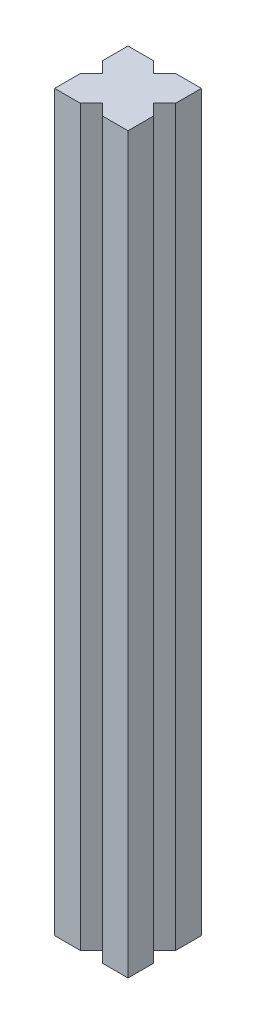
ISO-10303-21;
HEADER;
FILE_DESCRIPTION(('STEP AP214'),'2;1');
FILE_NAME('part.step','',(''),(''),'','','');
FILE_SCHEMA(('AUTOMOTIVE_DESIGN { 1 0 10303 214 1 1 1 1 }'));
ENDSEC;
DATA;
#1=APPLICATION_CONTEXT('core data for automotive mechanical design processes');
#2=APPLICATION_PROTOCOL_DEFINITION('international standard','automotive_design',2000,#1);
#3=PRODUCT_CONTEXT('',#1,'mechanical');
#4=PRODUCT('Part','Part','',(#3));
#5=PRODUCT_RELATED_PRODUCT_CATEGORY('part','',(#4));
#6=PRODUCT_DEFINITION_FORMATION('','',#4);
#7=PRODUCT_DEFINITION_CONTEXT('part definition',#1,'design');
#8=PRODUCT_DEFINITION('design','',#6,#7);
#9=PRODUCT_DEFINITION_SHAPE('','',#8);
#10=(LENGTH_UNIT() NAMED_UNIT(*) SI_UNIT(.MILLI.,.METRE.));
#11=(NAMED_UNIT(*) PLANE_ANGLE_UNIT() SI_UNIT($,.RADIAN.));
#12=(NAMED_UNIT(*) SI_UNIT($,.STERADIAN.) SOLID_ANGLE_UNIT());
#13=UNCERTAINTY_MEASURE_WITH_UNIT(LENGTH_MEASURE(1.E-05),#10,'distance_accuracy_value','');
#14=(GEOMETRIC_REPRESENTATION_CONTEXT(3) GLOBAL_UNCERTAINTY_ASSIGNED_CONTEXT((#13)) GLOBAL_UNIT_ASSIGNED_CONTEXT((#10,
#11,#12)) REPRESENTATION_CONTEXT('',''));
#15=CARTESIAN_POINT('',(0.,0.,0.));
#16=DIRECTION('',(0.,0.,1.));
#17=DIRECTION('',(1.,0.,0.));
#18=AXIS2_PLACEMENT_3D('',#15,#16,#17);
#19=CARTESIAN_POINT('',(0.,200.,0.));
#20=DIRECTION('',(1.,0.,0.));
#21=DIRECTION('',(0.,0.,-1.));
#22=AXIS2_PLACEMENT_3D('',#19,#20,#21);
#23=PLANE('',#22);
#24=DIRECTION('',(0.,0.,1.));
#25=VECTOR('',#24,1.);
#26=CARTESIAN_POINT('',(0.,200.,0.));
#27=LINE('',#26,#25);
#28=CARTESIAN_POINT('',(0.,200.,-7.));
#29=VERTEX_POINT('',#28);
#30=CARTESIAN_POINT('',(0.,200.,0.));
#31=VERTEX_POINT('',#30);
#32=EDGE_CURVE('E181',#29,#31,#27,.T.);
#33=ORIENTED_EDGE('',*,*,#32,.F.);
#34=DIRECTION('',(0.,1.,0.));
#35=VECTOR('',#34,1.);
#36=CARTESIAN_POINT('',(0.,0.,-7.));
#37=LINE('',#36,#35);
#38=CARTESIAN_POINT('',(0.,0.,-7.));
#39=VERTEX_POINT('',#38);
#40=EDGE_CURVE('E231',#39,#29,#37,.T.);
#41=ORIENTED_EDGE('',*,*,#40,.F.);
#42=DIRECTION('',(0.,0.,1.));
#43=VECTOR('',#42,1.);
#44=CARTESIAN_POINT('',(0.,0.,0.));
#45=LINE('',#44,#43);
#46=CARTESIAN_POINT('',(0.,0.,0.));
#47=VERTEX_POINT('',#46);
#48=EDGE_CURVE('E293',#39,#47,#45,.T.);
#49=ORIENTED_EDGE('',*,*,#48,.T.);
#50=DIRECTION('',(0.,-1.,0.));
#51=VECTOR('',#50,1.);
#52=CARTESIAN_POINT('',(0.,200.,0.));
#53=LINE('',#52,#51);
#54=EDGE_CURVE('E11',#31,#47,#53,.T.);
#55=ORIENTED_EDGE('',*,*,#54,.F.);
#56=EDGE_LOOP('',(#33,#41,#49,#55));
#57=FACE_BOUND('',#56,.T.);
#58=ADVANCED_FACE('F34',(#57),#23,.F.);
#59=CARTESIAN_POINT('',(0.,200.,0.));
#60=DIRECTION('',(0.,0.,-1.));
#61=DIRECTION('',(-1.,0.,0.));
#62=AXIS2_PLACEMENT_3D('',#59,#60,#61);
#63=PLANE('',#62);
#64=DIRECTION('',(1.,0.,0.));
#65=VECTOR('',#64,1.);
#66=CARTESIAN_POINT('',(0.,0.,0.));
#67=LINE('',#66,#65);
#68=CARTESIAN_POINT('',(7.,0.,0.));
#69=VERTEX_POINT('',#68);
#70=EDGE_CURVE('E294',#47,#69,#67,.T.);
#71=ORIENTED_EDGE('',*,*,#70,.T.);
#72=DIRECTION('',(0.,1.,0.));
#73=VECTOR('',#72,1.);
#74=CARTESIAN_POINT('',(7.,0.,0.));
#75=LINE('',#74,#73);
#76=CARTESIAN_POINT('',(7.,200.,0.));
#77=VERTEX_POINT('',#76);
#78=EDGE_CURVE('E265',#69,#77,#75,.T.);
#79=ORIENTED_EDGE('',*,*,#78,.T.);
#80=DIRECTION('',(1.,0.,0.));
#81=VECTOR('',#80,1.);
#82=CARTESIAN_POINT('',(0.,200.,0.));
#83=LINE('',#82,#81);
#84=EDGE_CURVE('E284',#31,#77,#83,.T.);
#85=ORIENTED_EDGE('',*,*,#84,.F.);
#86=ORIENTED_EDGE('',*,*,#54,.T.);
#87=EDGE_LOOP('',(#71,#79,#85,#86));
#88=FACE_BOUND('',#87,.T.);
#89=ADVANCED_FACE('F311',(#88),#63,.F.);
#90=CARTESIAN_POINT('',(20.,200.,0.));
#91=DIRECTION('',(-1.,0.,0.));
#92=DIRECTION('',(0.,0.,1.));
#93=AXIS2_PLACEMENT_3D('',#90,#91,#92);
#94=PLANE('',#93);
#95=DIRECTION('',(0.,0.,-1.));
#96=VECTOR('',#95,1.);
#97=CARTESIAN_POINT('',(20.,0.,0.));
#98=LINE('',#97,#96);
#99=CARTESIAN_POINT('',(20.,0.,0.));
#100=VERTEX_POINT('',#99);
#101=CARTESIAN_POINT('',(20.,0.,-7.));
#102=VERTEX_POINT('',#101);
#103=EDGE_CURVE('E174',#100,#102,#98,.T.);
#104=ORIENTED_EDGE('',*,*,#103,.T.);
#105=DIRECTION('',(0.,1.,0.));
#106=VECTOR('',#105,1.);
#107=CARTESIAN_POINT('',(20.,0.,-7.));
#108=LINE('',#107,#106);
#109=CARTESIAN_POINT('',(20.,200.,-7.));
#110=VERTEX_POINT('',#109);
#111=EDGE_CURVE('E233',#102,#110,#108,.T.);
#112=ORIENTED_EDGE('',*,*,#111,.T.);
#113=DIRECTION('',(0.,0.,-1.));
#114=VECTOR('',#113,1.);
#115=CARTESIAN_POINT('',(20.,200.,0.));
#116=LINE('',#115,#114);
#117=CARTESIAN_POINT('',(20.,200.,0.));
#118=VERTEX_POINT('',#117);
#119=EDGE_CURVE('E207',#118,#110,#116,.T.);
#120=ORIENTED_EDGE('',*,*,#119,.F.);
#121=DIRECTION('',(0.,-1.,0.));
#122=VECTOR('',#121,1.);
#123=CARTESIAN_POINT('',(20.,200.,0.));
#124=LINE('',#123,#122);
#125=EDGE_CURVE('E43',#118,#100,#124,.T.);
#126=ORIENTED_EDGE('',*,*,#125,.T.);
#127=EDGE_LOOP('',(#104,#112,#120,#126));
#128=FACE_BOUND('',#127,.T.);
#129=ADVANCED_FACE('F204',(#128),#94,.F.);
#130=CARTESIAN_POINT('',(0.,200.,-20.));
#131=DIRECTION('',(0.,0.,1.));
#132=DIRECTION('',(1.,0.,0.));
#133=AXIS2_PLACEMENT_3D('',#130,#131,#132);
#134=PLANE('',#133);
#135=DIRECTION('',(-1.,0.,0.));
#136=VECTOR('',#135,1.);
#137=CARTESIAN_POINT('',(0.,0.,-20.));
#138=LINE('',#137,#136);
#139=CARTESIAN_POINT('',(20.,0.,-20.));
#140=VERTEX_POINT('',#139);
#141=CARTESIAN_POINT('',(13.,0.,-20.));
#142=VERTEX_POINT('',#141);
#143=EDGE_CURVE('E173',#140,#142,#138,.T.);
#144=ORIENTED_EDGE('',*,*,#143,.T.);
#145=DIRECTION('',(0.,1.,0.));
#146=VECTOR('',#145,1.);
#147=CARTESIAN_POINT('',(13.,0.,-20.));
#148=LINE('',#147,#146);
#149=CARTESIAN_POINT('',(13.,200.,-20.));
#150=VERTEX_POINT('',#149);
#151=EDGE_CURVE('E317',#142,#150,#148,.T.);
#152=ORIENTED_EDGE('',*,*,#151,.T.);
#153=DIRECTION('',(-1.,0.,0.));
#154=VECTOR('',#153,1.);
#155=CARTESIAN_POINT('',(0.,200.,-20.));
#156=LINE('',#155,#154);
#157=CARTESIAN_POINT('',(20.,200.,-20.));
#158=VERTEX_POINT('',#157);
#159=EDGE_CURVE('E192',#158,#150,#156,.T.);
#160=ORIENTED_EDGE('',*,*,#159,.F.);
#161=DIRECTION('',(0.,-1.,0.));
#162=VECTOR('',#161,1.);
#163=CARTESIAN_POINT('',(20.,200.,-20.));
#164=LINE('',#163,#162);
#165=EDGE_CURVE('E191',#158,#140,#164,.T.);
#166=ORIENTED_EDGE('',*,*,#165,.T.);
#167=EDGE_LOOP('',(#144,#152,#160,#166));
#168=FACE_BOUND('',#167,.T.);
#169=ADVANCED_FACE('F333',(#168),#134,.F.);
#170=CARTESIAN_POINT('',(0.,0.,-20.));
#171=VERTEX_POINT('',#170);
#172=CARTESIAN_POINT('',(0.,0.,-13.));
#173=VERTEX_POINT('',#172);
#174=EDGE_CURVE('E171',#171,#173,#45,.T.);
#175=ORIENTED_EDGE('',*,*,#174,.T.);
#176=DIRECTION('',(0.,1.,0.));
#177=VECTOR('',#176,1.);
#178=CARTESIAN_POINT('',(0.,0.,-13.));
#179=LINE('',#178,#177);
#180=CARTESIAN_POINT('',(0.,200.,-13.));
#181=VERTEX_POINT('',#180);
#182=EDGE_CURVE('E254',#173,#181,#179,.T.);
#183=ORIENTED_EDGE('',*,*,#182,.T.);
#184=CARTESIAN_POINT('',(0.,200.,-20.));
#185=VERTEX_POINT('',#184);
#186=EDGE_CURVE('E279',#185,#181,#27,.T.);
#187=ORIENTED_EDGE('',*,*,#186,.F.);
#188=DIRECTION('',(0.,-1.,0.));
#189=VECTOR('',#188,1.);
#190=CARTESIAN_POINT('',(0.,200.,-20.));
#191=LINE('',#190,#189);
#192=EDGE_CURVE('E188',#185,#171,#191,.T.);
#193=ORIENTED_EDGE('',*,*,#192,.T.);
#194=EDGE_LOOP('',(#175,#183,#187,#193));
#195=FACE_BOUND('',#194,.T.);
#196=ADVANCED_FACE('F36',(#195),#23,.F.);
#197=CARTESIAN_POINT('',(13.,200.,0.));
#198=VERTEX_POINT('',#197);
#199=EDGE_CURVE('E283',#198,#118,#83,.T.);
#200=ORIENTED_EDGE('',*,*,#199,.F.);
#201=DIRECTION('',(0.,1.,0.));
#202=VECTOR('',#201,1.);
#203=CARTESIAN_POINT('',(13.,0.,0.));
#204=LINE('',#203,#202);
#205=CARTESIAN_POINT('',(13.,0.,0.));
#206=VERTEX_POINT('',#205);
#207=EDGE_CURVE('E274',#206,#198,#204,.T.);
#208=ORIENTED_EDGE('',*,*,#207,.F.);
#209=EDGE_CURVE('E212',#206,#100,#67,.T.);
#210=ORIENTED_EDGE('',*,*,#209,.T.);
#211=ORIENTED_EDGE('',*,*,#125,.F.);
#212=EDGE_LOOP('',(#200,#208,#210,#211));
#213=FACE_BOUND('',#212,.T.);
#214=ADVANCED_FACE('F300',(#213),#63,.F.);
#215=CARTESIAN_POINT('',(20.,200.,-13.));
#216=VERTEX_POINT('',#215);
#217=EDGE_CURVE('E287',#216,#158,#116,.T.);
#218=ORIENTED_EDGE('',*,*,#217,.F.);
#219=DIRECTION('',(0.,1.,0.));
#220=VECTOR('',#219,1.);
#221=CARTESIAN_POINT('',(20.,0.,-13.));
#222=LINE('',#221,#220);
#223=CARTESIAN_POINT('',(20.,0.,-13.));
#224=VERTEX_POINT('',#223);
#225=EDGE_CURVE('E216',#224,#216,#222,.T.);
#226=ORIENTED_EDGE('',*,*,#225,.F.);
#227=EDGE_CURVE('E184',#224,#140,#98,.T.);
#228=ORIENTED_EDGE('',*,*,#227,.T.);
#229=ORIENTED_EDGE('',*,*,#165,.F.);
#230=EDGE_LOOP('',(#218,#226,#228,#229));
#231=FACE_BOUND('',#230,.T.);
#232=ADVANCED_FACE('F337',(#231),#94,.F.);
#233=CARTESIAN_POINT('',(7.,200.,-20.));
#234=VERTEX_POINT('',#233);
#235=EDGE_CURVE('E164',#234,#185,#156,.T.);
#236=ORIENTED_EDGE('',*,*,#235,.F.);
#237=DIRECTION('',(0.,1.,0.));
#238=VECTOR('',#237,1.);
#239=CARTESIAN_POINT('',(7.,0.,-20.));
#240=LINE('',#239,#238);
#241=CARTESIAN_POINT('',(7.,0.,-20.));
#242=VERTEX_POINT('',#241);
#243=EDGE_CURVE('E151',#242,#234,#240,.T.);
#244=ORIENTED_EDGE('',*,*,#243,.F.);
#245=EDGE_CURVE('E162',#242,#171,#138,.T.);
#246=ORIENTED_EDGE('',*,*,#245,.T.);
#247=ORIENTED_EDGE('',*,*,#192,.F.);
#248=EDGE_LOOP('',(#236,#244,#246,#247));
#249=FACE_BOUND('',#248,.T.);
#250=ADVANCED_FACE('F160',(#249),#134,.F.);
#251=CARTESIAN_POINT('',(0.,200.,0.));
#252=DIRECTION('',(0.,-1.,0.));
#253=DIRECTION('',(0.,0.,-1.));
#254=AXIS2_PLACEMENT_3D('',#251,#252,#253);
#255=PLANE('',#254);
#256=ORIENTED_EDGE('',*,*,#159,.T.);
#257=DIRECTION('',(0.707106781186548,0.,-0.707106781186547));
#258=VECTOR('',#257,1.);
#259=CARTESIAN_POINT('',(13.,200.,-20.));
#260=LINE('',#259,#258);
#261=CARTESIAN_POINT('',(10.,200.,-17.));
#262=VERTEX_POINT('',#261);
#263=EDGE_CURVE('E156',#262,#150,#260,.T.);
#264=ORIENTED_EDGE('',*,*,#263,.F.);
#265=DIRECTION('',(0.707106781186548,0.,0.707106781186547));
#266=VECTOR('',#265,1.);
#267=CARTESIAN_POINT('',(7.,200.,-20.));
#268=LINE('',#267,#266);
#269=EDGE_CURVE('E235',#234,#262,#268,.T.);
#270=ORIENTED_EDGE('',*,*,#269,.F.);
#271=ORIENTED_EDGE('',*,*,#235,.T.);
#272=ORIENTED_EDGE('',*,*,#186,.T.);
#273=DIRECTION('',(-0.707106781186547,0.,-0.707106781186548));
#274=VECTOR('',#273,1.);
#275=CARTESIAN_POINT('',(0.,200.,-13.));
#276=LINE('',#275,#274);
#277=CARTESIAN_POINT('',(2.99999999999999,200.,-10.));
#278=VERTEX_POINT('',#277);
#279=EDGE_CURVE('E242',#278,#181,#276,.T.);
#280=ORIENTED_EDGE('',*,*,#279,.F.);
#281=DIRECTION('',(0.707106781186548,0.,-0.707106781186547));
#282=VECTOR('',#281,1.);
#283=CARTESIAN_POINT('',(0.,200.,-7.));
#284=LINE('',#283,#282);
#285=EDGE_CURVE('E246',#29,#278,#284,.T.);
#286=ORIENTED_EDGE('',*,*,#285,.F.);
#287=ORIENTED_EDGE('',*,*,#32,.T.);
#288=ORIENTED_EDGE('',*,*,#84,.T.);
#289=DIRECTION('',(-0.707106781186547,0.,0.707106781186548));
#290=VECTOR('',#289,1.);
#291=CARTESIAN_POINT('',(7.,200.,0.));
#292=LINE('',#291,#290);
#293=CARTESIAN_POINT('',(10.,200.,-3.));
#294=VERTEX_POINT('',#293);
#295=EDGE_CURVE('E266',#294,#77,#292,.T.);
#296=ORIENTED_EDGE('',*,*,#295,.F.);
#297=DIRECTION('',(-0.707106781186547,0.,-0.707106781186548));
#298=VECTOR('',#297,1.);
#299=CARTESIAN_POINT('',(13.,200.,0.));
#300=LINE('',#299,#298);
#301=EDGE_CURVE('E263',#198,#294,#300,.T.);
#302=ORIENTED_EDGE('',*,*,#301,.F.);
#303=ORIENTED_EDGE('',*,*,#199,.T.);
#304=ORIENTED_EDGE('',*,*,#119,.T.);
#305=DIRECTION('',(0.707106781186548,0.,0.707106781186547));
#306=VECTOR('',#305,1.);
#307=CARTESIAN_POINT('',(20.,200.,-7.));
#308=LINE('',#307,#306);
#309=CARTESIAN_POINT('',(17.,200.,-10.));
#310=VERTEX_POINT('',#309);
#311=EDGE_CURVE('E224',#310,#110,#308,.T.);
#312=ORIENTED_EDGE('',*,*,#311,.F.);
#313=DIRECTION('',(-0.707106781186547,0.,0.707106781186548));
#314=VECTOR('',#313,1.);
#315=CARTESIAN_POINT('',(20.,200.,-13.));
#316=LINE('',#315,#314);
#317=EDGE_CURVE('E227',#216,#310,#316,.T.);
#318=ORIENTED_EDGE('',*,*,#317,.F.);
#319=ORIENTED_EDGE('',*,*,#217,.T.);
#320=EDGE_LOOP('',(#256,#264,#270,#271,#272,#280,#286,#287,#288,#296,#302,#303,#304,#312,#318,#319));
#321=FACE_BOUND('',#320,.T.);
#322=ADVANCED_FACE('F307',(#321),#255,.F.);
#323=CARTESIAN_POINT('',(0.,0.,0.));
#324=DIRECTION('',(0.,-1.,0.));
#325=DIRECTION('',(0.,0.,-1.));
#326=AXIS2_PLACEMENT_3D('',#323,#324,#325);
#327=PLANE('',#326);
#328=DIRECTION('',(0.707106781186548,0.,-0.707106781186547));
#329=VECTOR('',#328,1.);
#330=CARTESIAN_POINT('',(13.,0.,-20.));
#331=LINE('',#330,#329);
#332=CARTESIAN_POINT('',(10.,0.,-17.));
#333=VERTEX_POINT('',#332);
#334=EDGE_CURVE('E50',#333,#142,#331,.T.);
#335=ORIENTED_EDGE('',*,*,#334,.T.);
#336=ORIENTED_EDGE('',*,*,#143,.F.);
#337=ORIENTED_EDGE('',*,*,#227,.F.);
#338=DIRECTION('',(-0.707106781186547,0.,0.707106781186548));
#339=VECTOR('',#338,1.);
#340=CARTESIAN_POINT('',(20.,0.,-13.));
#341=LINE('',#340,#339);
#342=CARTESIAN_POINT('',(17.,0.,-10.));
#343=VERTEX_POINT('',#342);
#344=EDGE_CURVE('E215',#224,#343,#341,.T.);
#345=ORIENTED_EDGE('',*,*,#344,.T.);
#346=DIRECTION('',(0.707106781186548,0.,0.707106781186547));
#347=VECTOR('',#346,1.);
#348=CARTESIAN_POINT('',(20.,0.,-7.));
#349=LINE('',#348,#347);
#350=EDGE_CURVE('E58',#343,#102,#349,.T.);
#351=ORIENTED_EDGE('',*,*,#350,.T.);
#352=ORIENTED_EDGE('',*,*,#103,.F.);
#353=ORIENTED_EDGE('',*,*,#209,.F.);
#354=DIRECTION('',(-0.707106781186547,0.,-0.707106781186548));
#355=VECTOR('',#354,1.);
#356=CARTESIAN_POINT('',(13.,0.,0.));
#357=LINE('',#356,#355);
#358=CARTESIAN_POINT('',(10.,0.,-3.));
#359=VERTEX_POINT('',#358);
#360=EDGE_CURVE('E262',#206,#359,#357,.T.);
#361=ORIENTED_EDGE('',*,*,#360,.T.);
#362=DIRECTION('',(-0.707106781186547,0.,0.707106781186548));
#363=VECTOR('',#362,1.);
#364=CARTESIAN_POINT('',(7.,0.,0.));
#365=LINE('',#364,#363);
#366=EDGE_CURVE('E259',#359,#69,#365,.T.);
#367=ORIENTED_EDGE('',*,*,#366,.T.);
#368=ORIENTED_EDGE('',*,*,#70,.F.);
#369=ORIENTED_EDGE('',*,*,#48,.F.);
#370=DIRECTION('',(0.707106781186548,0.,-0.707106781186547));
#371=VECTOR('',#370,1.);
#372=CARTESIAN_POINT('',(0.,0.,-7.));
#373=LINE('',#372,#371);
#374=CARTESIAN_POINT('',(2.99999999999999,0.,-10.));
#375=VERTEX_POINT('',#374);
#376=EDGE_CURVE('E238',#39,#375,#373,.T.);
#377=ORIENTED_EDGE('',*,*,#376,.T.);
#378=DIRECTION('',(-0.707106781186547,0.,-0.707106781186548));
#379=VECTOR('',#378,1.);
#380=CARTESIAN_POINT('',(0.,0.,-13.));
#381=LINE('',#380,#379);
#382=EDGE_CURVE('E241',#375,#173,#381,.T.);
#383=ORIENTED_EDGE('',*,*,#382,.T.);
#384=ORIENTED_EDGE('',*,*,#174,.F.);
#385=ORIENTED_EDGE('',*,*,#245,.F.);
#386=DIRECTION('',(0.707106781186548,0.,0.707106781186547));
#387=VECTOR('',#386,1.);
#388=CARTESIAN_POINT('',(7.,0.,-20.));
#389=LINE('',#388,#387);
#390=EDGE_CURVE('E147',#242,#333,#389,.T.);
#391=ORIENTED_EDGE('',*,*,#390,.T.);
#392=EDGE_LOOP('',(#335,#336,#337,#345,#351,#352,#353,#361,#367,#368,#369,#377,#383,#384,#385,#391));
#393=FACE_BOUND('',#392,.T.);
#394=ADVANCED_FACE('F168',(#393),#327,.T.);
#395=CARTESIAN_POINT('',(7.,0.,0.));
#396=DIRECTION('',(-0.707106781186548,0.,-0.707106781186547));
#397=DIRECTION('',(-0.707106781186547,0.,0.707106781186548));
#398=AXIS2_PLACEMENT_3D('',#395,#396,#397);
#399=PLANE('',#398);
#400=ORIENTED_EDGE('',*,*,#295,.T.);
#401=ORIENTED_EDGE('',*,*,#78,.F.);
#402=ORIENTED_EDGE('',*,*,#366,.F.);
#403=DIRECTION('',(0.,1.,0.));
#404=VECTOR('',#403,1.);
#405=CARTESIAN_POINT('',(10.,0.,-3.));
#406=LINE('',#405,#404);
#407=EDGE_CURVE('E249',#359,#294,#406,.T.);
#408=ORIENTED_EDGE('',*,*,#407,.T.);
#409=EDGE_LOOP('',(#400,#401,#402,#408));
#410=FACE_BOUND('',#409,.T.);
#411=ADVANCED_FACE('F310',(#410),#399,.F.);
#412=CARTESIAN_POINT('',(13.,0.,0.));
#413=DIRECTION('',(0.707106781186548,0.,-0.707106781186547));
#414=DIRECTION('',(-0.707106781186547,0.,-0.707106781186548));
#415=AXIS2_PLACEMENT_3D('',#412,#413,#414);
#416=PLANE('',#415);
#417=ORIENTED_EDGE('',*,*,#301,.T.);
#418=ORIENTED_EDGE('',*,*,#407,.F.);
#419=ORIENTED_EDGE('',*,*,#360,.F.);
#420=ORIENTED_EDGE('',*,*,#207,.T.);
#421=EDGE_LOOP('',(#417,#418,#419,#420));
#422=FACE_BOUND('',#421,.T.);
#423=ADVANCED_FACE('F303',(#422),#416,.F.);
#424=CARTESIAN_POINT('',(0.,0.,-7.));
#425=DIRECTION('',(0.707106781186547,0.,0.707106781186548));
#426=DIRECTION('',(0.707106781186548,0.,-0.707106781186547));
#427=AXIS2_PLACEMENT_3D('',#424,#425,#426);
#428=PLANE('',#427);
#429=ORIENTED_EDGE('',*,*,#285,.T.);
#430=DIRECTION('',(0.,1.,0.));
#431=VECTOR('',#430,1.);
#432=CARTESIAN_POINT('',(2.99999999999999,0.,-10.));
#433=LINE('',#432,#431);
#434=EDGE_CURVE('E245',#375,#278,#433,.T.);
#435=ORIENTED_EDGE('',*,*,#434,.F.);
#436=ORIENTED_EDGE('',*,*,#376,.F.);
#437=ORIENTED_EDGE('',*,*,#40,.T.);
#438=EDGE_LOOP('',(#429,#435,#436,#437));
#439=FACE_BOUND('',#438,.T.);
#440=ADVANCED_FACE('F353',(#439),#428,.F.);
#441=CARTESIAN_POINT('',(0.,0.,-13.));
#442=DIRECTION('',(0.707106781186548,0.,-0.707106781186547));
#443=DIRECTION('',(-0.707106781186547,0.,-0.707106781186548));
#444=AXIS2_PLACEMENT_3D('',#441,#442,#443);
#445=PLANE('',#444);
#446=ORIENTED_EDGE('',*,*,#279,.T.);
#447=ORIENTED_EDGE('',*,*,#182,.F.);
#448=ORIENTED_EDGE('',*,*,#382,.F.);
#449=ORIENTED_EDGE('',*,*,#434,.T.);
#450=EDGE_LOOP('',(#446,#447,#448,#449));
#451=FACE_BOUND('',#450,.T.);
#452=ADVANCED_FACE('F345',(#451),#445,.F.);
#453=CARTESIAN_POINT('',(20.,0.,-7.));
#454=DIRECTION('',(-0.707106781186547,0.,0.707106781186548));
#455=DIRECTION('',(0.707106781186548,0.,0.707106781186547));
#456=AXIS2_PLACEMENT_3D('',#453,#454,#455);
#457=PLANE('',#456);
#458=ORIENTED_EDGE('',*,*,#311,.T.);
#459=ORIENTED_EDGE('',*,*,#111,.F.);
#460=ORIENTED_EDGE('',*,*,#350,.F.);
#461=DIRECTION('',(0.,1.,0.));
#462=VECTOR('',#461,1.);
#463=CARTESIAN_POINT('',(17.,0.,-10.));
#464=LINE('',#463,#462);
#465=EDGE_CURVE('E221',#343,#310,#464,.T.);
#466=ORIENTED_EDGE('',*,*,#465,.T.);
#467=EDGE_LOOP('',(#458,#459,#460,#466));
#468=FACE_BOUND('',#467,.T.);
#469=ADVANCED_FACE('F343',(#468),#457,.F.);
#470=CARTESIAN_POINT('',(20.,0.,-13.));
#471=DIRECTION('',(-0.707106781186548,0.,-0.707106781186547));
#472=DIRECTION('',(-0.707106781186547,0.,0.707106781186548));
#473=AXIS2_PLACEMENT_3D('',#470,#471,#472);
#474=PLANE('',#473);
#475=ORIENTED_EDGE('',*,*,#317,.T.);
#476=ORIENTED_EDGE('',*,*,#465,.F.);
#477=ORIENTED_EDGE('',*,*,#344,.F.);
#478=ORIENTED_EDGE('',*,*,#225,.T.);
#479=EDGE_LOOP('',(#475,#476,#477,#478));
#480=FACE_BOUND('',#479,.T.);
#481=ADVANCED_FACE('F341',(#480),#474,.F.);
#482=CARTESIAN_POINT('',(13.,0.,-20.));
#483=DIRECTION('',(0.707106781186547,0.,0.707106781186548));
#484=DIRECTION('',(0.707106781186548,0.,-0.707106781186547));
#485=AXIS2_PLACEMENT_3D('',#482,#483,#484);
#486=PLANE('',#485);
#487=ORIENTED_EDGE('',*,*,#263,.T.);
#488=ORIENTED_EDGE('',*,*,#151,.F.);
#489=ORIENTED_EDGE('',*,*,#334,.F.);
#490=DIRECTION('',(0.,1.,0.));
#491=VECTOR('',#490,1.);
#492=CARTESIAN_POINT('',(10.,0.,-17.));
#493=LINE('',#492,#491);
#494=EDGE_CURVE('E153',#333,#262,#493,.T.);
#495=ORIENTED_EDGE('',*,*,#494,.T.);
#496=EDGE_LOOP('',(#487,#488,#489,#495));
#497=FACE_BOUND('',#496,.T.);
#498=ADVANCED_FACE('F351',(#497),#486,.F.);
#499=CARTESIAN_POINT('',(7.,0.,-20.));
#500=DIRECTION('',(-0.707106781186547,0.,0.707106781186548));
#501=DIRECTION('',(0.707106781186548,0.,0.707106781186547));
#502=AXIS2_PLACEMENT_3D('',#499,#500,#501);
#503=PLANE('',#502);
#504=ORIENTED_EDGE('',*,*,#269,.T.);
#505=ORIENTED_EDGE('',*,*,#494,.F.);
#506=ORIENTED_EDGE('',*,*,#390,.F.);
#507=ORIENTED_EDGE('',*,*,#243,.T.);
#508=EDGE_LOOP('',(#504,#505,#506,#507));
#509=FACE_BOUND('',#508,.T.);
#510=ADVANCED_FACE('F150',(#509),#503,.F.);
#511=CLOSED_SHELL('',(#58,#89,#129,#169,#196,#214,#232,#250,#322,#394,#411,#423,#440,#452,#469,
#481,#498,#510));
#512=MANIFOLD_SOLID_BREP('B2',#511);
#513=ADVANCED_BREP_SHAPE_REPRESENTATION('',(#18,#512),#14);
#514=SHAPE_DEFINITION_REPRESENTATION(#9,#513);
ENDSEC;
END-ISO-10303-21;
